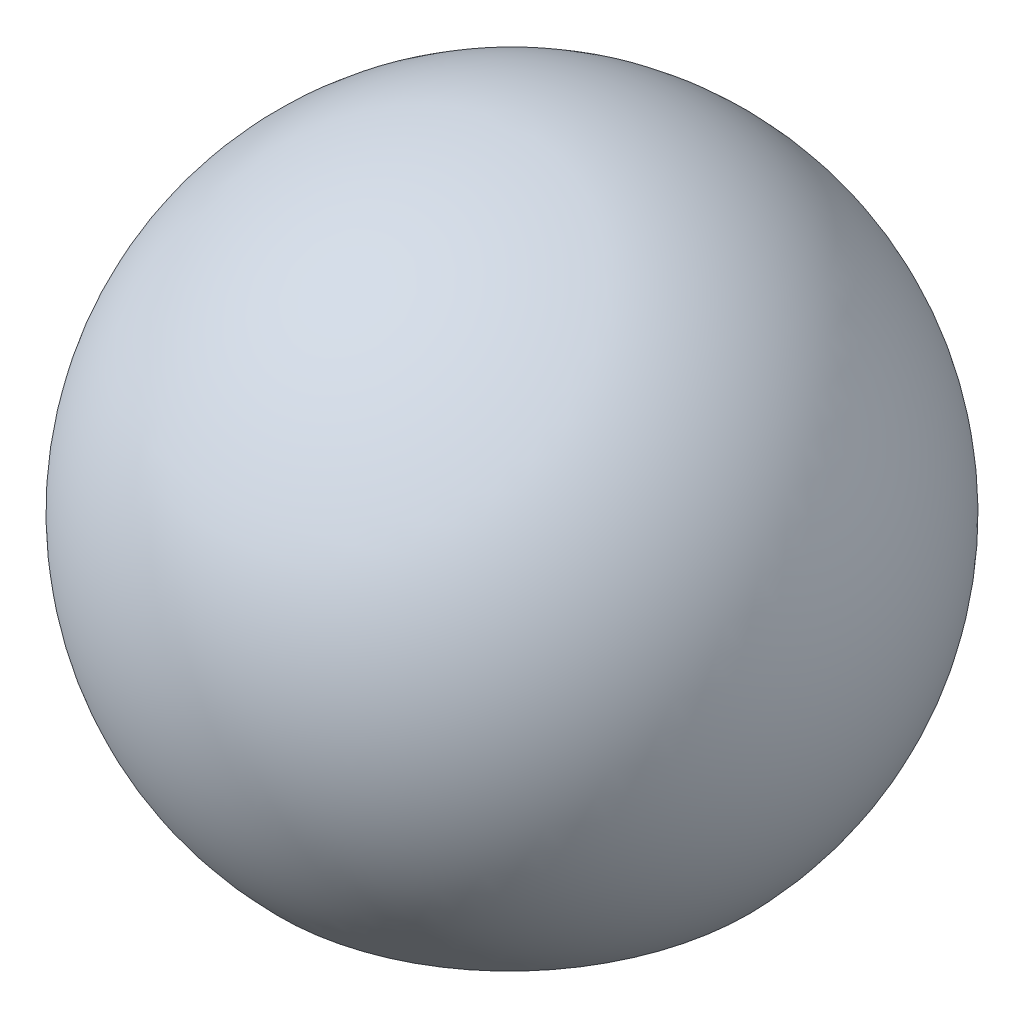
ISO-10303-21;
HEADER;
FILE_DESCRIPTION(('STEP AP214'),'2;1');
FILE_NAME('part.step','',(''),(''),'','','');
FILE_SCHEMA(('AUTOMOTIVE_DESIGN { 1 0 10303 214 1 1 1 1 }'));
ENDSEC;
DATA;
#1=APPLICATION_CONTEXT('core data for automotive mechanical design processes');
#2=APPLICATION_PROTOCOL_DEFINITION('international standard','automotive_design',2000,#1);
#3=PRODUCT_CONTEXT('',#1,'mechanical');
#4=PRODUCT('Part','Part','',(#3));
#5=PRODUCT_RELATED_PRODUCT_CATEGORY('part','',(#4));
#6=PRODUCT_DEFINITION_FORMATION('','',#4);
#7=PRODUCT_DEFINITION_CONTEXT('part definition',#1,'design');
#8=PRODUCT_DEFINITION('design','',#6,#7);
#9=PRODUCT_DEFINITION_SHAPE('','',#8);
#10=(LENGTH_UNIT() NAMED_UNIT(*) SI_UNIT(.MILLI.,.METRE.));
#11=(NAMED_UNIT(*) PLANE_ANGLE_UNIT() SI_UNIT($,.RADIAN.));
#12=(NAMED_UNIT(*) SI_UNIT($,.STERADIAN.) SOLID_ANGLE_UNIT());
#13=UNCERTAINTY_MEASURE_WITH_UNIT(LENGTH_MEASURE(1.E-05),#10,'distance_accuracy_value','');
#14=(GEOMETRIC_REPRESENTATION_CONTEXT(3) GLOBAL_UNCERTAINTY_ASSIGNED_CONTEXT((#13)) GLOBAL_UNIT_ASSIGNED_CONTEXT((#10,
#11,#12)) REPRESENTATION_CONTEXT('',''));
#15=CARTESIAN_POINT('',(0.,0.,0.));
#16=DIRECTION('',(0.,0.,1.));
#17=DIRECTION('',(1.,0.,0.));
#18=AXIS2_PLACEMENT_3D('',#15,#16,#17);
#19=CARTESIAN_POINT('',(2.56563825006769,-106.579782639213,0.));
#20=DIRECTION('',(-0.0240654947568381,0.999710384042353,0.));
#21=DIRECTION('',(-0.999710384042353,-0.0240654947568381,0.));
#22=AXIS2_PLACEMENT_3D('',#19,#20,#21);
#23=CONICAL_SURFACE('',#22,105.580328731037,1.54672850851845);
#24=CARTESIAN_POINT('',(2.62680260446529,-109.120625486715,0.));
#25=VERTEX_POINT('',#24);
#26=VERTEX_LOOP('',#25);
#27=FACE_BOUND('',#26,.T.);
#28=CARTESIAN_POINT('',(2.56563825006769,-106.579782639213,0.));
#29=DIRECTION('',(0.0240654947568381,-0.999710384042353,0.));
#30=DIRECTION('',(0.999710384042353,0.0240654947568381,0.));
#31=AXIS2_PLACEMENT_3D('',#28,#29,#30);
#32=CIRCLE('',#31,105.580328731037);
#33=CARTESIAN_POINT('',(108.115389233091,-104.038939791711,0.));
#34=VERTEX_POINT('',#33);
#35=EDGE_CURVE('E11',#34,#34,#32,.T.);
#36=ORIENTED_EDGE('',*,*,#35,.T.);
#37=EDGE_LOOP('',(#36));
#38=FACE_BOUND('',#37,.T.);
#39=ADVANCED_FACE('F37',(#27,#38),#23,.T.);
#40=CARTESIAN_POINT('',(0.,0.,0.));
#41=DIRECTION('',(0.0240654947568381,-0.999710384042353,0.));
#42=DIRECTION('',(-0.999710384042353,-0.0240654947568381,0.));
#43=AXIS2_PLACEMENT_3D('',#40,#41,#42);
#44=SPHERICAL_SURFACE('',#43,150.043454978902);
#45=ORIENTED_EDGE('',*,*,#35,.F.);
#46=EDGE_LOOP('',(#45));
#47=FACE_BOUND('',#46,.T.);
#48=ADVANCED_FACE('F46',(#47),#44,.T.);
#49=CLOSED_SHELL('',(#39,#48));
#50=MANIFOLD_SOLID_BREP('B2',#49);
#51=ADVANCED_BREP_SHAPE_REPRESENTATION('',(#18,#50),#14);
#52=SHAPE_DEFINITION_REPRESENTATION(#9,#51);
ENDSEC;
END-ISO-10303-21;
